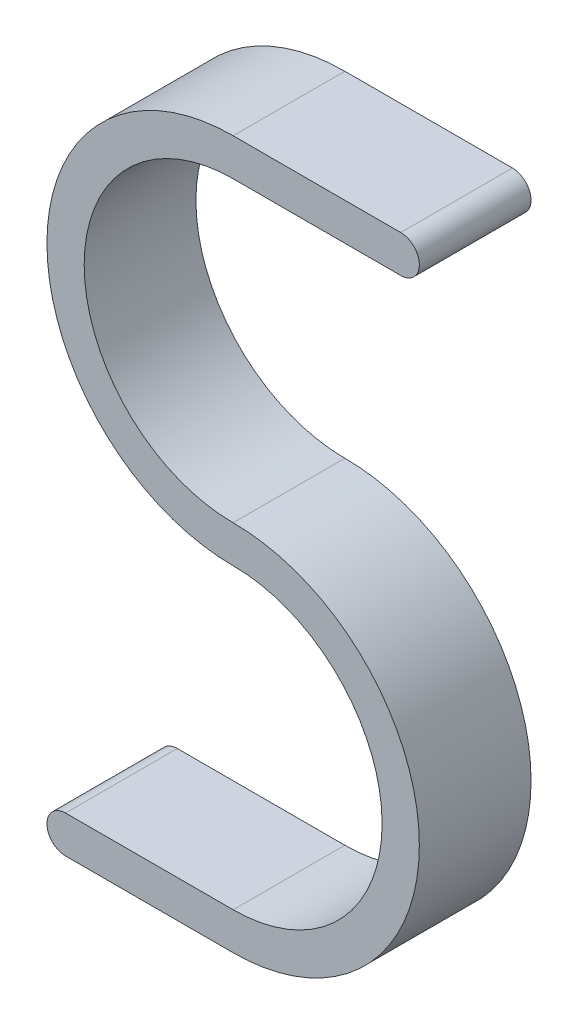
ISO-10303-21;
HEADER;
FILE_DESCRIPTION(('STEP AP214'),'2;1');
FILE_NAME('part.step','',(''),(''),'','','');
FILE_SCHEMA(('AUTOMOTIVE_DESIGN { 1 0 10303 214 1 1 1 1 }'));
ENDSEC;
DATA;
#1=APPLICATION_CONTEXT('core data for automotive mechanical design processes');
#2=APPLICATION_PROTOCOL_DEFINITION('international standard','automotive_design',2000,#1);
#3=PRODUCT_CONTEXT('',#1,'mechanical');
#4=PRODUCT('Part','Part','',(#3));
#5=PRODUCT_RELATED_PRODUCT_CATEGORY('part','',(#4));
#6=PRODUCT_DEFINITION_FORMATION('','',#4);
#7=PRODUCT_DEFINITION_CONTEXT('part definition',#1,'design');
#8=PRODUCT_DEFINITION('design','',#6,#7);
#9=PRODUCT_DEFINITION_SHAPE('','',#8);
#10=(LENGTH_UNIT() NAMED_UNIT(*) SI_UNIT(.MILLI.,.METRE.));
#11=(NAMED_UNIT(*) PLANE_ANGLE_UNIT() SI_UNIT($,.RADIAN.));
#12=(NAMED_UNIT(*) SI_UNIT($,.STERADIAN.) SOLID_ANGLE_UNIT());
#13=UNCERTAINTY_MEASURE_WITH_UNIT(LENGTH_MEASURE(1.E-05),#10,'distance_accuracy_value','');
#14=(GEOMETRIC_REPRESENTATION_CONTEXT(3) GLOBAL_UNCERTAINTY_ASSIGNED_CONTEXT((#13)) GLOBAL_UNIT_ASSIGNED_CONTEXT((#10,
#11,#12)) REPRESENTATION_CONTEXT('',''));
#15=CARTESIAN_POINT('',(0.,0.,0.));
#16=DIRECTION('',(0.,0.,1.));
#17=DIRECTION('',(1.,0.,0.));
#18=AXIS2_PLACEMENT_3D('',#15,#16,#17);
#19=CARTESIAN_POINT('',(22.5,47.5,15.));
#20=DIRECTION('',(0.,0.,-1.));
#21=DIRECTION('',(-1.,0.,0.));
#22=AXIS2_PLACEMENT_3D('',#19,#20,#21);
#23=CYLINDRICAL_SURFACE('',#22,2.5);
#24=CARTESIAN_POINT('',(22.5,47.5,0.));
#25=DIRECTION('',(0.,0.,1.));
#26=DIRECTION('',(1.,0.,0.));
#27=AXIS2_PLACEMENT_3D('',#24,#25,#26);
#28=CIRCLE('',#27,2.5);
#29=CARTESIAN_POINT('',(22.5,45.,0.));
#30=VERTEX_POINT('',#29);
#31=CARTESIAN_POINT('',(22.5,50.,0.));
#32=VERTEX_POINT('',#31);
#33=EDGE_CURVE('E154',#30,#32,#28,.T.);
#34=ORIENTED_EDGE('',*,*,#33,.T.);
#35=DIRECTION('',(0.,0.,-1.));
#36=VECTOR('',#35,1.);
#37=CARTESIAN_POINT('',(22.5,50.,15.));
#38=LINE('',#37,#36);
#39=CARTESIAN_POINT('',(22.5,50.,15.));
#40=VERTEX_POINT('',#39);
#41=EDGE_CURVE('E11',#40,#32,#38,.T.);
#42=ORIENTED_EDGE('',*,*,#41,.F.);
#43=CARTESIAN_POINT('',(22.5,47.5,15.));
#44=DIRECTION('',(0.,0.,1.));
#45=DIRECTION('',(1.,0.,0.));
#46=AXIS2_PLACEMENT_3D('',#43,#44,#45);
#47=CIRCLE('',#46,2.5);
#48=CARTESIAN_POINT('',(22.5,45.,15.));
#49=VERTEX_POINT('',#48);
#50=EDGE_CURVE('E182',#49,#40,#47,.T.);
#51=ORIENTED_EDGE('',*,*,#50,.F.);
#52=DIRECTION('',(0.,0.,-1.));
#53=VECTOR('',#52,1.);
#54=CARTESIAN_POINT('',(22.5,45.,15.));
#55=LINE('',#54,#53);
#56=EDGE_CURVE('E150',#49,#30,#55,.T.);
#57=ORIENTED_EDGE('',*,*,#56,.T.);
#58=EDGE_LOOP('',(#34,#42,#51,#57));
#59=FACE_BOUND('',#58,.T.);
#60=ADVANCED_FACE('F41',(#59),#23,.T.);
#61=CARTESIAN_POINT('',(0.,50.,15.));
#62=DIRECTION('',(0.,-1.,0.));
#63=DIRECTION('',(1.,0.,0.));
#64=AXIS2_PLACEMENT_3D('',#61,#62,#63);
#65=PLANE('',#64);
#66=DIRECTION('',(-1.,0.,0.));
#67=VECTOR('',#66,1.);
#68=CARTESIAN_POINT('',(0.,50.,0.));
#69=LINE('',#68,#67);
#70=CARTESIAN_POINT('',(0.,50.,0.));
#71=VERTEX_POINT('',#70);
#72=EDGE_CURVE('E158',#32,#71,#69,.T.);
#73=ORIENTED_EDGE('',*,*,#72,.T.);
#74=DIRECTION('',(0.,0.,-1.));
#75=VECTOR('',#74,1.);
#76=CARTESIAN_POINT('',(0.,50.,15.));
#77=LINE('',#76,#75);
#78=CARTESIAN_POINT('',(0.,50.,15.));
#79=VERTEX_POINT('',#78);
#80=EDGE_CURVE('E50',#79,#71,#77,.T.);
#81=ORIENTED_EDGE('',*,*,#80,.F.);
#82=DIRECTION('',(-1.,0.,0.));
#83=VECTOR('',#82,1.);
#84=CARTESIAN_POINT('',(0.,50.,15.));
#85=LINE('',#84,#83);
#86=EDGE_CURVE('E107',#40,#79,#85,.T.);
#87=ORIENTED_EDGE('',*,*,#86,.F.);
#88=ORIENTED_EDGE('',*,*,#41,.T.);
#89=EDGE_LOOP('',(#73,#81,#87,#88));
#90=FACE_BOUND('',#89,.T.);
#91=ADVANCED_FACE('F246',(#90),#65,.F.);
#92=CARTESIAN_POINT('',(0.,25.,15.));
#93=DIRECTION('',(0.,0.,-1.));
#94=DIRECTION('',(-1.,0.,0.));
#95=AXIS2_PLACEMENT_3D('',#92,#93,#94);
#96=CYLINDRICAL_SURFACE('',#95,25.);
#97=CARTESIAN_POINT('',(0.,25.,0.));
#98=DIRECTION('',(0.,0.,1.));
#99=DIRECTION('',(1.,0.,0.));
#100=AXIS2_PLACEMENT_3D('',#97,#98,#99);
#101=CIRCLE('',#100,25.);
#102=CARTESIAN_POINT('',(0.,0.,0.));
#103=VERTEX_POINT('',#102);
#104=EDGE_CURVE('E161',#71,#103,#101,.T.);
#105=ORIENTED_EDGE('',*,*,#104,.T.);
#106=DIRECTION('',(0.,0.,-1.));
#107=VECTOR('',#106,1.);
#108=CARTESIAN_POINT('',(0.,0.,15.));
#109=LINE('',#108,#107);
#110=CARTESIAN_POINT('',(0.,0.,15.));
#111=VERTEX_POINT('',#110);
#112=EDGE_CURVE('E201',#111,#103,#109,.T.);
#113=ORIENTED_EDGE('',*,*,#112,.F.);
#114=CARTESIAN_POINT('',(0.,25.,15.));
#115=DIRECTION('',(0.,0.,1.));
#116=DIRECTION('',(1.,0.,0.));
#117=AXIS2_PLACEMENT_3D('',#114,#115,#116);
#118=CIRCLE('',#117,25.);
#119=EDGE_CURVE('E211',#79,#111,#118,.T.);
#120=ORIENTED_EDGE('',*,*,#119,.F.);
#121=ORIENTED_EDGE('',*,*,#80,.T.);
#122=EDGE_LOOP('',(#105,#113,#120,#121));
#123=FACE_BOUND('',#122,.T.);
#124=ADVANCED_FACE('F209',(#123),#96,.T.);
#125=CARTESIAN_POINT('',(0.,-20.,15.));
#126=DIRECTION('',(0.,0.,-1.));
#127=DIRECTION('',(-1.,0.,0.));
#128=AXIS2_PLACEMENT_3D('',#125,#126,#127);
#129=CYLINDRICAL_SURFACE('',#128,20.);
#130=CARTESIAN_POINT('',(0.,-20.,0.));
#131=DIRECTION('',(0.,0.,-1.));
#132=DIRECTION('',(1.,0.,0.));
#133=AXIS2_PLACEMENT_3D('',#130,#131,#132);
#134=CIRCLE('',#133,20.);
#135=CARTESIAN_POINT('',(0.,-40.,0.));
#136=VERTEX_POINT('',#135);
#137=EDGE_CURVE('E164',#103,#136,#134,.T.);
#138=ORIENTED_EDGE('',*,*,#137,.T.);
#139=DIRECTION('',(0.,0.,-1.));
#140=VECTOR('',#139,1.);
#141=CARTESIAN_POINT('',(0.,-40.,15.));
#142=LINE('',#141,#140);
#143=CARTESIAN_POINT('',(0.,-40.,15.));
#144=VERTEX_POINT('',#143);
#145=EDGE_CURVE('E197',#144,#136,#142,.T.);
#146=ORIENTED_EDGE('',*,*,#145,.F.);
#147=CARTESIAN_POINT('',(0.,-20.,15.));
#148=DIRECTION('',(0.,0.,-1.));
#149=DIRECTION('',(1.,0.,0.));
#150=AXIS2_PLACEMENT_3D('',#147,#148,#149);
#151=CIRCLE('',#150,20.);
#152=EDGE_CURVE('E230',#111,#144,#151,.T.);
#153=ORIENTED_EDGE('',*,*,#152,.F.);
#154=ORIENTED_EDGE('',*,*,#112,.T.);
#155=EDGE_LOOP('',(#138,#146,#153,#154));
#156=FACE_BOUND('',#155,.T.);
#157=ADVANCED_FACE('F220',(#156),#129,.F.);
#158=CARTESIAN_POINT('',(0.,-40.,15.));
#159=DIRECTION('',(0.,-1.,0.));
#160=DIRECTION('',(0.,0.,-1.));
#161=AXIS2_PLACEMENT_3D('',#158,#159,#160);
#162=PLANE('',#161);
#163=DIRECTION('',(-1.,0.,0.));
#164=VECTOR('',#163,1.);
#165=CARTESIAN_POINT('',(0.,-40.,0.));
#166=LINE('',#165,#164);
#167=CARTESIAN_POINT('',(-22.5,-40.,0.));
#168=VERTEX_POINT('',#167);
#169=EDGE_CURVE('E167',#136,#168,#166,.T.);
#170=ORIENTED_EDGE('',*,*,#169,.T.);
#171=DIRECTION('',(0.,0.,-1.));
#172=VECTOR('',#171,1.);
#173=CARTESIAN_POINT('',(-22.5,-40.,15.));
#174=LINE('',#173,#172);
#175=CARTESIAN_POINT('',(-22.5,-40.,15.));
#176=VERTEX_POINT('',#175);
#177=EDGE_CURVE('E193',#176,#168,#174,.T.);
#178=ORIENTED_EDGE('',*,*,#177,.F.);
#179=DIRECTION('',(-1.,0.,0.));
#180=VECTOR('',#179,1.);
#181=CARTESIAN_POINT('',(0.,-40.,15.));
#182=LINE('',#181,#180);
#183=EDGE_CURVE('E226',#144,#176,#182,.T.);
#184=ORIENTED_EDGE('',*,*,#183,.F.);
#185=ORIENTED_EDGE('',*,*,#145,.T.);
#186=EDGE_LOOP('',(#170,#178,#184,#185));
#187=FACE_BOUND('',#186,.T.);
#188=ADVANCED_FACE('F224',(#187),#162,.F.);
#189=CARTESIAN_POINT('',(-22.5,-42.5,15.));
#190=DIRECTION('',(0.,0.,-1.));
#191=DIRECTION('',(-1.,0.,0.));
#192=AXIS2_PLACEMENT_3D('',#189,#190,#191);
#193=CYLINDRICAL_SURFACE('',#192,2.50000000000001);
#194=CARTESIAN_POINT('',(-22.5,-42.5,0.));
#195=DIRECTION('',(0.,0.,1.));
#196=DIRECTION('',(1.,0.,0.));
#197=AXIS2_PLACEMENT_3D('',#194,#195,#196);
#198=CIRCLE('',#197,2.50000000000001);
#199=CARTESIAN_POINT('',(-22.5,-45.,0.));
#200=VERTEX_POINT('',#199);
#201=EDGE_CURVE('E170',#168,#200,#198,.T.);
#202=ORIENTED_EDGE('',*,*,#201,.T.);
#203=DIRECTION('',(0.,0.,-1.));
#204=VECTOR('',#203,1.);
#205=CARTESIAN_POINT('',(-22.5,-45.,15.));
#206=LINE('',#205,#204);
#207=CARTESIAN_POINT('',(-22.5,-45.,15.));
#208=VERTEX_POINT('',#207);
#209=EDGE_CURVE('E189',#208,#200,#206,.T.);
#210=ORIENTED_EDGE('',*,*,#209,.F.);
#211=CARTESIAN_POINT('',(-22.5,-42.5,15.));
#212=DIRECTION('',(0.,0.,1.));
#213=DIRECTION('',(1.,0.,0.));
#214=AXIS2_PLACEMENT_3D('',#211,#212,#213);
#215=CIRCLE('',#214,2.50000000000001);
#216=EDGE_CURVE('E229',#176,#208,#215,.T.);
#217=ORIENTED_EDGE('',*,*,#216,.F.);
#218=ORIENTED_EDGE('',*,*,#177,.T.);
#219=EDGE_LOOP('',(#202,#210,#217,#218));
#220=FACE_BOUND('',#219,.T.);
#221=ADVANCED_FACE('F258',(#220),#193,.T.);
#222=CARTESIAN_POINT('',(0.,-45.,15.));
#223=DIRECTION('',(0.,1.,0.));
#224=DIRECTION('',(-1.,0.,0.));
#225=AXIS2_PLACEMENT_3D('',#222,#223,#224);
#226=PLANE('',#225);
#227=DIRECTION('',(1.,0.,0.));
#228=VECTOR('',#227,1.);
#229=CARTESIAN_POINT('',(0.,-45.,0.));
#230=LINE('',#229,#228);
#231=CARTESIAN_POINT('',(0.,-45.,0.));
#232=VERTEX_POINT('',#231);
#233=EDGE_CURVE('E173',#200,#232,#230,.T.);
#234=ORIENTED_EDGE('',*,*,#233,.T.);
#235=DIRECTION('',(0.,0.,-1.));
#236=VECTOR('',#235,1.);
#237=CARTESIAN_POINT('',(0.,-45.,15.));
#238=LINE('',#237,#236);
#239=CARTESIAN_POINT('',(0.,-45.,15.));
#240=VERTEX_POINT('',#239);
#241=EDGE_CURVE('E143',#240,#232,#238,.T.);
#242=ORIENTED_EDGE('',*,*,#241,.F.);
#243=DIRECTION('',(1.,0.,0.));
#244=VECTOR('',#243,1.);
#245=CARTESIAN_POINT('',(0.,-45.,15.));
#246=LINE('',#245,#244);
#247=EDGE_CURVE('E132',#208,#240,#246,.T.);
#248=ORIENTED_EDGE('',*,*,#247,.F.);
#249=ORIENTED_EDGE('',*,*,#209,.T.);
#250=EDGE_LOOP('',(#234,#242,#248,#249));
#251=FACE_BOUND('',#250,.T.);
#252=ADVANCED_FACE('F261',(#251),#226,.F.);
#253=CARTESIAN_POINT('',(0.,-20.,15.));
#254=DIRECTION('',(0.,0.,-1.));
#255=DIRECTION('',(-1.,0.,0.));
#256=AXIS2_PLACEMENT_3D('',#253,#254,#255);
#257=CYLINDRICAL_SURFACE('',#256,25.);
#258=CARTESIAN_POINT('',(0.,-20.,0.));
#259=DIRECTION('',(0.,0.,1.));
#260=DIRECTION('',(1.,0.,0.));
#261=AXIS2_PLACEMENT_3D('',#258,#259,#260);
#262=CIRCLE('',#261,25.);
#263=CARTESIAN_POINT('',(0.,5.,0.));
#264=VERTEX_POINT('',#263);
#265=EDGE_CURVE('E141',#232,#264,#262,.T.);
#266=ORIENTED_EDGE('',*,*,#265,.T.);
#267=DIRECTION('',(0.,0.,-1.));
#268=VECTOR('',#267,1.);
#269=CARTESIAN_POINT('',(0.,5.,15.));
#270=LINE('',#269,#268);
#271=CARTESIAN_POINT('',(0.,5.,15.));
#272=VERTEX_POINT('',#271);
#273=EDGE_CURVE('E138',#272,#264,#270,.T.);
#274=ORIENTED_EDGE('',*,*,#273,.F.);
#275=CARTESIAN_POINT('',(0.,-20.,15.));
#276=DIRECTION('',(0.,0.,1.));
#277=DIRECTION('',(1.,0.,0.));
#278=AXIS2_PLACEMENT_3D('',#275,#276,#277);
#279=CIRCLE('',#278,25.);
#280=EDGE_CURVE('E126',#240,#272,#279,.T.);
#281=ORIENTED_EDGE('',*,*,#280,.F.);
#282=ORIENTED_EDGE('',*,*,#241,.T.);
#283=EDGE_LOOP('',(#266,#274,#281,#282));
#284=FACE_BOUND('',#283,.T.);
#285=ADVANCED_FACE('F139',(#284),#257,.T.);
#286=CARTESIAN_POINT('',(0.,25.,15.));
#287=DIRECTION('',(0.,0.,-1.));
#288=DIRECTION('',(-1.,0.,0.));
#289=AXIS2_PLACEMENT_3D('',#286,#287,#288);
#290=CYLINDRICAL_SURFACE('',#289,20.);
#291=CARTESIAN_POINT('',(0.,25.,0.));
#292=DIRECTION('',(0.,0.,-1.));
#293=DIRECTION('',(1.,0.,0.));
#294=AXIS2_PLACEMENT_3D('',#291,#292,#293);
#295=CIRCLE('',#294,20.);
#296=CARTESIAN_POINT('',(0.,45.,0.));
#297=VERTEX_POINT('',#296);
#298=EDGE_CURVE('E93',#264,#297,#295,.T.);
#299=ORIENTED_EDGE('',*,*,#298,.T.);
#300=DIRECTION('',(0.,0.,-1.));
#301=VECTOR('',#300,1.);
#302=CARTESIAN_POINT('',(0.,45.,15.));
#303=LINE('',#302,#301);
#304=CARTESIAN_POINT('',(0.,45.,15.));
#305=VERTEX_POINT('',#304);
#306=EDGE_CURVE('E144',#305,#297,#303,.T.);
#307=ORIENTED_EDGE('',*,*,#306,.F.);
#308=CARTESIAN_POINT('',(0.,25.,15.));
#309=DIRECTION('',(0.,0.,-1.));
#310=DIRECTION('',(1.,0.,0.));
#311=AXIS2_PLACEMENT_3D('',#308,#309,#310);
#312=CIRCLE('',#311,20.);
#313=EDGE_CURVE('E130',#272,#305,#312,.T.);
#314=ORIENTED_EDGE('',*,*,#313,.F.);
#315=ORIENTED_EDGE('',*,*,#273,.T.);
#316=EDGE_LOOP('',(#299,#307,#314,#315));
#317=FACE_BOUND('',#316,.T.);
#318=ADVANCED_FACE('F146',(#317),#290,.F.);
#319=CARTESIAN_POINT('',(0.,45.,15.));
#320=DIRECTION('',(0.,1.,0.));
#321=DIRECTION('',(0.,0.,1.));
#322=AXIS2_PLACEMENT_3D('',#319,#320,#321);
#323=PLANE('',#322);
#324=DIRECTION('',(1.,0.,0.));
#325=VECTOR('',#324,1.);
#326=CARTESIAN_POINT('',(0.,45.,0.));
#327=LINE('',#326,#325);
#328=EDGE_CURVE('E99',#297,#30,#327,.T.);
#329=ORIENTED_EDGE('',*,*,#328,.T.);
#330=ORIENTED_EDGE('',*,*,#56,.F.);
#331=DIRECTION('',(1.,0.,0.));
#332=VECTOR('',#331,1.);
#333=CARTESIAN_POINT('',(0.,45.,15.));
#334=LINE('',#333,#332);
#335=EDGE_CURVE('E58',#305,#49,#334,.T.);
#336=ORIENTED_EDGE('',*,*,#335,.F.);
#337=ORIENTED_EDGE('',*,*,#306,.T.);
#338=EDGE_LOOP('',(#329,#330,#336,#337));
#339=FACE_BOUND('',#338,.T.);
#340=ADVANCED_FACE('F270',(#339),#323,.F.);
#341=CARTESIAN_POINT('',(22.5,47.5,15.));
#342=DIRECTION('',(0.,0.,1.));
#343=DIRECTION('',(1.,0.,0.));
#344=AXIS2_PLACEMENT_3D('',#341,#342,#343);
#345=PLANE('',#344);
#346=ORIENTED_EDGE('',*,*,#50,.T.);
#347=ORIENTED_EDGE('',*,*,#86,.T.);
#348=ORIENTED_EDGE('',*,*,#119,.T.);
#349=ORIENTED_EDGE('',*,*,#152,.T.);
#350=ORIENTED_EDGE('',*,*,#183,.T.);
#351=ORIENTED_EDGE('',*,*,#216,.T.);
#352=ORIENTED_EDGE('',*,*,#247,.T.);
#353=ORIENTED_EDGE('',*,*,#280,.T.);
#354=ORIENTED_EDGE('',*,*,#313,.T.);
#355=ORIENTED_EDGE('',*,*,#335,.T.);
#356=EDGE_LOOP('',(#346,#347,#348,#349,#350,#351,#352,#353,#354,#355));
#357=FACE_BOUND('',#356,.T.);
#358=ADVANCED_FACE('F128',(#357),#345,.T.);
#359=CARTESIAN_POINT('',(22.5,47.5,0.));
#360=DIRECTION('',(0.,0.,1.));
#361=DIRECTION('',(1.,0.,0.));
#362=AXIS2_PLACEMENT_3D('',#359,#360,#361);
#363=PLANE('',#362);
#364=ORIENTED_EDGE('',*,*,#33,.F.);
#365=ORIENTED_EDGE('',*,*,#328,.F.);
#366=ORIENTED_EDGE('',*,*,#298,.F.);
#367=ORIENTED_EDGE('',*,*,#265,.F.);
#368=ORIENTED_EDGE('',*,*,#233,.F.);
#369=ORIENTED_EDGE('',*,*,#201,.F.);
#370=ORIENTED_EDGE('',*,*,#169,.F.);
#371=ORIENTED_EDGE('',*,*,#137,.F.);
#372=ORIENTED_EDGE('',*,*,#104,.F.);
#373=ORIENTED_EDGE('',*,*,#72,.F.);
#374=EDGE_LOOP('',(#364,#365,#366,#367,#368,#369,#370,#371,#372,#373));
#375=FACE_BOUND('',#374,.T.);
#376=ADVANCED_FACE('F215',(#375),#363,.F.);
#377=CLOSED_SHELL('',(#60,#91,#124,#157,#188,#221,#252,#285,#318,#340,#358,#376));
#378=MANIFOLD_SOLID_BREP('B2',#377);
#379=ADVANCED_BREP_SHAPE_REPRESENTATION('',(#18,#378),#14);
#380=SHAPE_DEFINITION_REPRESENTATION(#9,#379);
ENDSEC;
END-ISO-10303-21;
